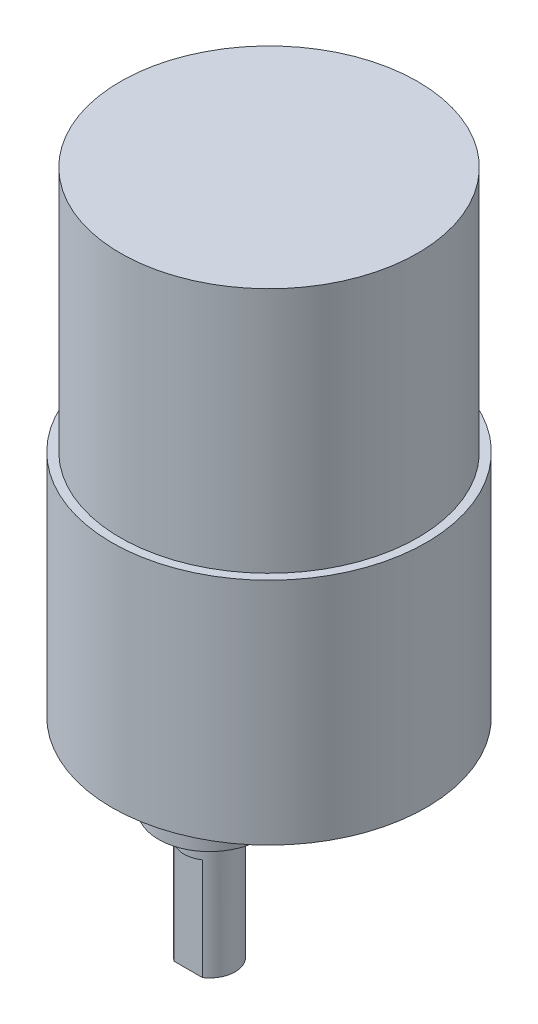
ISO-10303-21;
HEADER;
FILE_DESCRIPTION(('STEP AP214'),'2;1');
FILE_NAME('part.step','',(''),(''),'','','');
FILE_SCHEMA(('AUTOMOTIVE_DESIGN { 1 0 10303 214 1 1 1 1 }'));
ENDSEC;
DATA;
#1=APPLICATION_CONTEXT('core data for automotive mechanical design processes');
#2=APPLICATION_PROTOCOL_DEFINITION('international standard','automotive_design',2000,#1);
#3=PRODUCT_CONTEXT('',#1,'mechanical');
#4=PRODUCT('Part','Part','',(#3));
#5=PRODUCT_RELATED_PRODUCT_CATEGORY('part','',(#4));
#6=PRODUCT_DEFINITION_FORMATION('','',#4);
#7=PRODUCT_DEFINITION_CONTEXT('part definition',#1,'design');
#8=PRODUCT_DEFINITION('design','',#6,#7);
#9=PRODUCT_DEFINITION_SHAPE('','',#8);
#10=(LENGTH_UNIT() NAMED_UNIT(*) SI_UNIT(.MILLI.,.METRE.));
#11=(NAMED_UNIT(*) PLANE_ANGLE_UNIT() SI_UNIT($,.RADIAN.));
#12=(NAMED_UNIT(*) SI_UNIT($,.STERADIAN.) SOLID_ANGLE_UNIT());
#13=UNCERTAINTY_MEASURE_WITH_UNIT(LENGTH_MEASURE(1.E-05),#10,'distance_accuracy_value','');
#14=(GEOMETRIC_REPRESENTATION_CONTEXT(3) GLOBAL_UNCERTAINTY_ASSIGNED_CONTEXT((#13)) GLOBAL_UNIT_ASSIGNED_CONTEXT((#10,
#11,#12)) REPRESENTATION_CONTEXT('',''));
#15=CARTESIAN_POINT('',(0.,0.,0.));
#16=DIRECTION('',(0.,0.,1.));
#17=DIRECTION('',(1.,0.,0.));
#18=AXIS2_PLACEMENT_3D('',#15,#16,#17);
#19=CARTESIAN_POINT('',(0.,27.,0.));
#20=DIRECTION('',(0.,-1.,0.));
#21=DIRECTION('',(0.,0.,-1.));
#22=AXIS2_PLACEMENT_3D('',#19,#20,#21);
#23=CYLINDRICAL_SURFACE('',#22,18.5);
#24=CARTESIAN_POINT('',(0.,27.,0.));
#25=DIRECTION('',(0.,1.,0.));
#26=DIRECTION('',(0.,0.,1.));
#27=AXIS2_PLACEMENT_3D('',#24,#25,#26);
#28=CIRCLE('',#27,18.5);
#29=CARTESIAN_POINT('',(0.,27.,18.5));
#30=VERTEX_POINT('',#29);
#31=EDGE_CURVE('E122',#30,#30,#28,.T.);
#32=ORIENTED_EDGE('',*,*,#31,.F.);
#33=EDGE_LOOP('',(#32));
#34=FACE_BOUND('',#33,.T.);
#35=CARTESIAN_POINT('',(0.,0.,0.));
#36=DIRECTION('',(0.,1.,0.));
#37=DIRECTION('',(0.,0.,1.));
#38=AXIS2_PLACEMENT_3D('',#35,#36,#37);
#39=CIRCLE('',#38,18.5);
#40=CARTESIAN_POINT('',(0.,0.,18.5));
#41=VERTEX_POINT('',#40);
#42=EDGE_CURVE('E119',#41,#41,#39,.T.);
#43=ORIENTED_EDGE('',*,*,#42,.T.);
#44=EDGE_LOOP('',(#43));
#45=FACE_BOUND('',#44,.T.);
#46=ADVANCED_FACE('F33',(#34,#45),#23,.T.);
#47=CARTESIAN_POINT('',(0.,27.,0.));
#48=DIRECTION('',(0.,1.,0.));
#49=DIRECTION('',(0.,0.,1.));
#50=AXIS2_PLACEMENT_3D('',#47,#48,#49);
#51=PLANE('',#50);
#52=CARTESIAN_POINT('',(0.,27.,0.));
#53=DIRECTION('',(0.,1.,0.));
#54=DIRECTION('',(0.,0.,1.));
#55=AXIS2_PLACEMENT_3D('',#52,#53,#54);
#56=CIRCLE('',#55,17.5);
#57=CARTESIAN_POINT('',(0.,27.,-17.5));
#58=VERTEX_POINT('',#57);
#59=EDGE_CURVE('E113',#58,#58,#56,.T.);
#60=ORIENTED_EDGE('',*,*,#59,.F.);
#61=EDGE_LOOP('',(#60));
#62=FACE_BOUND('',#61,.T.);
#63=ORIENTED_EDGE('',*,*,#31,.T.);
#64=EDGE_LOOP('',(#63));
#65=FACE_BOUND('',#64,.T.);
#66=ADVANCED_FACE('F136',(#62,#65),#51,.T.);
#67=CARTESIAN_POINT('',(0.,0.,0.));
#68=DIRECTION('',(0.,1.,0.));
#69=DIRECTION('',(0.,0.,1.));
#70=AXIS2_PLACEMENT_3D('',#67,#68,#69);
#71=PLANE('',#70);
#72=CARTESIAN_POINT('',(0.,0.,7.));
#73=DIRECTION('',(0.,1.,0.));
#74=DIRECTION('',(0.,0.,1.));
#75=AXIS2_PLACEMENT_3D('',#72,#73,#74);
#76=CIRCLE('',#75,6.);
#77=CARTESIAN_POINT('',(0.,0.,13.));
#78=VERTEX_POINT('',#77);
#79=EDGE_CURVE('E61',#78,#78,#76,.F.);
#80=ORIENTED_EDGE('',*,*,#79,.F.);
#81=EDGE_LOOP('',(#80));
#82=FACE_BOUND('',#81,.T.);
#83=CARTESIAN_POINT('',(7.75000000000002,0.,-13.4233937586588));
#84=DIRECTION('',(0.,-1.,0.));
#85=DIRECTION('',(0.,0.,-1.));
#86=AXIS2_PLACEMENT_3D('',#83,#84,#85);
#87=CIRCLE('',#86,1.5);
#88=CARTESIAN_POINT('',(7.75000000000002,0.,-14.9233937586588));
#89=VERTEX_POINT('',#88);
#90=EDGE_CURVE('E74',#89,#89,#87,.T.);
#91=ORIENTED_EDGE('',*,*,#90,.F.);
#92=EDGE_LOOP('',(#91));
#93=FACE_BOUND('',#92,.T.);
#94=CARTESIAN_POINT('',(-7.75000000000003,0.,-13.4233937586588));
#95=DIRECTION('',(0.,-1.,0.));
#96=DIRECTION('',(0.,0.,-1.));
#97=AXIS2_PLACEMENT_3D('',#94,#95,#96);
#98=CIRCLE('',#97,1.5);
#99=CARTESIAN_POINT('',(-7.75000000000003,0.,-14.9233937586588));
#100=VERTEX_POINT('',#99);
#101=EDGE_CURVE('E90',#100,#100,#98,.T.);
#102=ORIENTED_EDGE('',*,*,#101,.F.);
#103=EDGE_LOOP('',(#102));
#104=FACE_BOUND('',#103,.T.);
#105=CARTESIAN_POINT('',(-7.75000000000002,0.,13.4233937586588));
#106=DIRECTION('',(0.,-1.,0.));
#107=DIRECTION('',(0.,0.,-1.));
#108=AXIS2_PLACEMENT_3D('',#105,#106,#107);
#109=CIRCLE('',#108,1.5);
#110=CARTESIAN_POINT('',(-7.75000000000002,0.,11.9233937586588));
#111=VERTEX_POINT('',#110);
#112=EDGE_CURVE('E84',#111,#111,#109,.T.);
#113=ORIENTED_EDGE('',*,*,#112,.F.);
#114=EDGE_LOOP('',(#113));
#115=FACE_BOUND('',#114,.T.);
#116=CARTESIAN_POINT('',(7.75000000000002,0.,13.4233937586588));
#117=DIRECTION('',(0.,-1.,0.));
#118=DIRECTION('',(0.,0.,-1.));
#119=AXIS2_PLACEMENT_3D('',#116,#117,#118);
#120=CIRCLE('',#119,1.5);
#121=CARTESIAN_POINT('',(7.75000000000002,0.,11.9233937586588));
#122=VERTEX_POINT('',#121);
#123=EDGE_CURVE('E83',#122,#122,#120,.T.);
#124=ORIENTED_EDGE('',*,*,#123,.F.);
#125=EDGE_LOOP('',(#124));
#126=FACE_BOUND('',#125,.T.);
#127=CARTESIAN_POINT('',(15.5,0.,0.));
#128=DIRECTION('',(0.,-1.,0.));
#129=DIRECTION('',(0.,0.,-1.));
#130=AXIS2_PLACEMENT_3D('',#127,#128,#129);
#131=CIRCLE('',#130,1.5);
#132=CARTESIAN_POINT('',(15.5,0.,-1.5));
#133=VERTEX_POINT('',#132);
#134=EDGE_CURVE('E102',#133,#133,#131,.T.);
#135=ORIENTED_EDGE('',*,*,#134,.F.);
#136=EDGE_LOOP('',(#135));
#137=FACE_BOUND('',#136,.T.);
#138=CARTESIAN_POINT('',(-15.5,0.,0.));
#139=DIRECTION('',(0.,-1.,0.));
#140=DIRECTION('',(0.,0.,-1.));
#141=AXIS2_PLACEMENT_3D('',#138,#139,#140);
#142=CIRCLE('',#141,1.5);
#143=CARTESIAN_POINT('',(-15.5,0.,-1.5));
#144=VERTEX_POINT('',#143);
#145=EDGE_CURVE('E101',#144,#144,#142,.T.);
#146=ORIENTED_EDGE('',*,*,#145,.F.);
#147=EDGE_LOOP('',(#146));
#148=FACE_BOUND('',#147,.T.);
#149=ORIENTED_EDGE('',*,*,#42,.F.);
#150=EDGE_LOOP('',(#149));
#151=FACE_BOUND('',#150,.T.);
#152=ADVANCED_FACE('F132',(#82,#93,#104,#115,#126,#137,#148,#151),#71,.F.);
#153=CARTESIAN_POINT('',(0.,56.,0.));
#154=DIRECTION('',(0.,-1.,0.));
#155=DIRECTION('',(0.,0.,-1.));
#156=AXIS2_PLACEMENT_3D('',#153,#154,#155);
#157=CYLINDRICAL_SURFACE('',#156,17.5);
#158=CARTESIAN_POINT('',(0.,56.,0.));
#159=DIRECTION('',(0.,1.,0.));
#160=DIRECTION('',(0.,0.,1.));
#161=AXIS2_PLACEMENT_3D('',#158,#159,#160);
#162=CIRCLE('',#161,17.5);
#163=CARTESIAN_POINT('',(0.,56.,-17.5));
#164=VERTEX_POINT('',#163);
#165=EDGE_CURVE('E116',#164,#164,#162,.T.);
#166=CARTESIAN_POINT('',(0.,56.,-17.5));
#167=CARTESIAN_POINT('',(0.,55.6979166666667,-17.5));
#168=CARTESIAN_POINT('',(0.,55.3958333333333,-17.5));
#169=CARTESIAN_POINT('',(0.,54.7916666666667,-17.5));
#170=CARTESIAN_POINT('',(0.,54.4895833333333,-17.5));
#171=CARTESIAN_POINT('',(0.,53.8854166666667,-17.5));
#172=CARTESIAN_POINT('',(0.,53.5833333333333,-17.5));
#173=CARTESIAN_POINT('',(0.,52.9791666666667,-17.5));
#174=CARTESIAN_POINT('',(0.,52.6770833333333,-17.5));
#175=CARTESIAN_POINT('',(0.,52.0729166666667,-17.5));
#176=CARTESIAN_POINT('',(0.,51.7708333333333,-17.5));
#177=CARTESIAN_POINT('',(0.,51.1666666666667,-17.5));
#178=CARTESIAN_POINT('',(0.,50.8645833333333,-17.5));
#179=CARTESIAN_POINT('',(0.,50.2604166666667,-17.5));
#180=CARTESIAN_POINT('',(0.,49.9583333333333,-17.5));
#181=CARTESIAN_POINT('',(0.,49.3541666666667,-17.5));
#182=CARTESIAN_POINT('',(0.,49.0520833333333,-17.5));
#183=CARTESIAN_POINT('',(0.,48.4479166666667,-17.5));
#184=CARTESIAN_POINT('',(0.,48.1458333333333,-17.5));
#185=CARTESIAN_POINT('',(0.,47.5416666666667,-17.5));
#186=CARTESIAN_POINT('',(0.,47.2395833333333,-17.5));
#187=CARTESIAN_POINT('',(0.,46.6354166666667,-17.5));
#188=CARTESIAN_POINT('',(0.,46.3333333333333,-17.5));
#189=CARTESIAN_POINT('',(0.,45.7291666666667,-17.5));
#190=CARTESIAN_POINT('',(0.,45.4270833333333,-17.5));
#191=CARTESIAN_POINT('',(0.,44.8229166666667,-17.5));
#192=CARTESIAN_POINT('',(0.,44.5208333333333,-17.5));
#193=CARTESIAN_POINT('',(0.,43.9166666666667,-17.5));
#194=CARTESIAN_POINT('',(0.,43.6145833333333,-17.5));
#195=CARTESIAN_POINT('',(0.,43.0104166666667,-17.5));
#196=CARTESIAN_POINT('',(0.,42.7083333333333,-17.5));
#197=CARTESIAN_POINT('',(0.,42.1041666666667,-17.5));
#198=CARTESIAN_POINT('',(0.,41.8020833333333,-17.5));
#199=CARTESIAN_POINT('',(0.,41.1979166666667,-17.5));
#200=CARTESIAN_POINT('',(0.,40.8958333333333,-17.5));
#201=CARTESIAN_POINT('',(0.,40.2916666666667,-17.5));
#202=CARTESIAN_POINT('',(0.,39.9895833333333,-17.5));
#203=CARTESIAN_POINT('',(0.,39.3854166666667,-17.5));
#204=CARTESIAN_POINT('',(0.,39.0833333333333,-17.5));
#205=CARTESIAN_POINT('',(0.,38.4791666666667,-17.5));
#206=CARTESIAN_POINT('',(0.,38.1770833333333,-17.5));
#207=CARTESIAN_POINT('',(0.,37.5729166666667,-17.5));
#208=CARTESIAN_POINT('',(0.,37.2708333333333,-17.5));
#209=CARTESIAN_POINT('',(0.,36.6666666666667,-17.5));
#210=CARTESIAN_POINT('',(0.,36.3645833333333,-17.5));
#211=CARTESIAN_POINT('',(0.,35.7604166666667,-17.5));
#212=CARTESIAN_POINT('',(0.,35.4583333333333,-17.5));
#213=CARTESIAN_POINT('',(0.,34.8541666666667,-17.5));
#214=CARTESIAN_POINT('',(0.,34.5520833333333,-17.5));
#215=CARTESIAN_POINT('',(0.,33.9479166666667,-17.5));
#216=CARTESIAN_POINT('',(0.,33.6458333333333,-17.5));
#217=CARTESIAN_POINT('',(0.,33.0416666666667,-17.5));
#218=CARTESIAN_POINT('',(0.,32.7395833333333,-17.5));
#219=CARTESIAN_POINT('',(0.,32.1354166666667,-17.5));
#220=CARTESIAN_POINT('',(0.,31.8333333333333,-17.5));
#221=CARTESIAN_POINT('',(0.,31.2291666666667,-17.5));
#222=CARTESIAN_POINT('',(0.,30.9270833333333,-17.5));
#223=CARTESIAN_POINT('',(0.,30.3229166666667,-17.5));
#224=CARTESIAN_POINT('',(0.,30.0208333333333,-17.5));
#225=CARTESIAN_POINT('',(0.,29.4166666666667,-17.5));
#226=CARTESIAN_POINT('',(0.,29.1145833333333,-17.5));
#227=CARTESIAN_POINT('',(0.,28.5104166666667,-17.5));
#228=CARTESIAN_POINT('',(0.,28.2083333333333,-17.5));
#229=CARTESIAN_POINT('',(0.,27.6041666666667,-17.5));
#230=CARTESIAN_POINT('',(0.,27.3020833333333,-17.5));
#231=CARTESIAN_POINT('',(0.,27.,-17.5));
#232=B_SPLINE_CURVE_WITH_KNOTS('',3,(#166,#167,#168,#169,#170,#171,#172,#173,#174,#175,#176,
#177,#178,#179,#180,#181,#182,#183,#184,#185,#186,#187,#188,#189,#190,#191,#192,#193,#194,#195,
#196,#197,#198,#199,#200,#201,#202,#203,#204,#205,#206,#207,#208,#209,#210,#211,#212,#213,#214,
#215,#216,#217,#218,#219,#220,#221,#222,#223,#224,#225,#226,#227,#228,#229,#230,#231),
.UNSPECIFIED.,.F.,.F.,(4,2,2,2,2,2,2,2,2,2,2,2,2,2,2,2,2,2,2,2,2,2,2,2,2,2,2,2,2,2,2,2,4),(0.,
0.906250000000004,1.8125,2.71875000000001,3.625,4.53125,5.4375,6.34375,7.25,8.15625,9.0625,
9.96875000000001,10.875,11.78125,12.6875,13.59375,14.5,15.40625,16.3125,17.21875,18.125,
19.03125,19.9375,20.84375,21.75,22.65625,23.5625,24.46875,25.375,26.28125,27.1875,28.09375,29.),.UNSPECIFIED.);
#233=EDGE_CURVE('BSEAM135',#164,#58,#232,.T.);
#234=ORIENTED_EDGE('',*,*,#165,.F.);
#235=ORIENTED_EDGE('',*,*,#59,.T.);
#236=ORIENTED_EDGE('',*,*,#233,.T.);
#237=ORIENTED_EDGE('',*,*,#233,.F.);
#238=EDGE_LOOP('',(#234,#236,#235,#237));
#239=FACE_BOUND('',#238,.T.);
#240=ADVANCED_FACE('F135',(#239),#157,.T.);
#241=CARTESIAN_POINT('',(0.,56.,0.));
#242=DIRECTION('',(0.,1.,0.));
#243=DIRECTION('',(0.,0.,1.));
#244=AXIS2_PLACEMENT_3D('',#241,#242,#243);
#245=PLANE('',#244);
#246=ORIENTED_EDGE('',*,*,#165,.T.);
#247=EDGE_LOOP('',(#246));
#248=FACE_BOUND('',#247,.T.);
#249=ADVANCED_FACE('F166',(#248),#245,.T.);
#250=CARTESIAN_POINT('',(-15.5,10.,0.));
#251=DIRECTION('',(0.,-1.,0.));
#252=DIRECTION('',(0.,0.,-1.));
#253=AXIS2_PLACEMENT_3D('',#250,#251,#252);
#254=CYLINDRICAL_SURFACE('',#253,1.5);
#255=CARTESIAN_POINT('',(-15.5,10.,0.));
#256=DIRECTION('',(0.,-1.,0.));
#257=DIRECTION('',(0.,0.,-1.));
#258=AXIS2_PLACEMENT_3D('',#255,#256,#257);
#259=CIRCLE('',#258,1.5);
#260=CARTESIAN_POINT('',(-15.5,10.,-1.5));
#261=VERTEX_POINT('',#260);
#262=EDGE_CURVE('E110',#261,#261,#259,.T.);
#263=ORIENTED_EDGE('',*,*,#262,.F.);
#264=EDGE_LOOP('',(#263));
#265=FACE_BOUND('',#264,.T.);
#266=ORIENTED_EDGE('',*,*,#145,.T.);
#267=EDGE_LOOP('',(#266));
#268=FACE_BOUND('',#267,.T.);
#269=ADVANCED_FACE('F170',(#265,#268),#254,.F.);
#270=CARTESIAN_POINT('',(-15.5,10.,0.));
#271=DIRECTION('',(0.,-1.,0.));
#272=DIRECTION('',(0.,0.,-1.));
#273=AXIS2_PLACEMENT_3D('',#270,#271,#272);
#274=PLANE('',#273);
#275=ORIENTED_EDGE('',*,*,#262,.T.);
#276=EDGE_LOOP('',(#275));
#277=FACE_BOUND('',#276,.T.);
#278=ADVANCED_FACE('F174',(#277),#274,.T.);
#279=CARTESIAN_POINT('',(15.5,10.,0.));
#280=DIRECTION('',(0.,-1.,0.));
#281=DIRECTION('',(0.,0.,-1.));
#282=AXIS2_PLACEMENT_3D('',#279,#280,#281);
#283=CYLINDRICAL_SURFACE('',#282,1.5);
#284=CARTESIAN_POINT('',(15.5,10.,0.));
#285=DIRECTION('',(0.,-1.,0.));
#286=DIRECTION('',(0.,0.,-1.));
#287=AXIS2_PLACEMENT_3D('',#284,#285,#286);
#288=CIRCLE('',#287,1.5);
#289=CARTESIAN_POINT('',(15.5,10.,-1.5));
#290=VERTEX_POINT('',#289);
#291=EDGE_CURVE('E98',#290,#290,#288,.T.);
#292=ORIENTED_EDGE('',*,*,#291,.F.);
#293=EDGE_LOOP('',(#292));
#294=FACE_BOUND('',#293,.T.);
#295=ORIENTED_EDGE('',*,*,#134,.T.);
#296=EDGE_LOOP('',(#295));
#297=FACE_BOUND('',#296,.T.);
#298=ADVANCED_FACE('F178',(#294,#297),#283,.F.);
#299=CARTESIAN_POINT('',(15.5,10.,0.));
#300=DIRECTION('',(0.,-1.,0.));
#301=DIRECTION('',(0.,0.,-1.));
#302=AXIS2_PLACEMENT_3D('',#299,#300,#301);
#303=PLANE('',#302);
#304=ORIENTED_EDGE('',*,*,#291,.T.);
#305=EDGE_LOOP('',(#304));
#306=FACE_BOUND('',#305,.T.);
#307=ADVANCED_FACE('F184',(#306),#303,.T.);
#308=CARTESIAN_POINT('',(7.75000000000002,10.,13.4233937586588));
#309=DIRECTION('',(0.,-1.,0.));
#310=DIRECTION('',(0.,0.,-1.));
#311=AXIS2_PLACEMENT_3D('',#308,#309,#310);
#312=CYLINDRICAL_SURFACE('',#311,1.5);
#313=CARTESIAN_POINT('',(7.75000000000002,10.,13.4233937586588));
#314=DIRECTION('',(0.,-1.,0.));
#315=DIRECTION('',(0.,0.,-1.));
#316=AXIS2_PLACEMENT_3D('',#313,#314,#315);
#317=CIRCLE('',#316,1.5);
#318=CARTESIAN_POINT('',(7.75000000000002,10.,11.9233937586588));
#319=VERTEX_POINT('',#318);
#320=EDGE_CURVE('E105',#319,#319,#317,.T.);
#321=ORIENTED_EDGE('',*,*,#320,.F.);
#322=EDGE_LOOP('',(#321));
#323=FACE_BOUND('',#322,.T.);
#324=ORIENTED_EDGE('',*,*,#123,.T.);
#325=EDGE_LOOP('',(#324));
#326=FACE_BOUND('',#325,.T.);
#327=ADVANCED_FACE('F180',(#323,#326),#312,.F.);
#328=CARTESIAN_POINT('',(7.75000000000002,10.,13.4233937586588));
#329=DIRECTION('',(0.,-1.,0.));
#330=DIRECTION('',(0.,0.,-1.));
#331=AXIS2_PLACEMENT_3D('',#328,#329,#330);
#332=PLANE('',#331);
#333=ORIENTED_EDGE('',*,*,#320,.T.);
#334=EDGE_LOOP('',(#333));
#335=FACE_BOUND('',#334,.T.);
#336=ADVANCED_FACE('F183',(#335),#332,.T.);
#337=CARTESIAN_POINT('',(-7.75000000000002,10.,13.4233937586588));
#338=DIRECTION('',(0.,-1.,0.));
#339=DIRECTION('',(0.,0.,-1.));
#340=AXIS2_PLACEMENT_3D('',#337,#338,#339);
#341=CYLINDRICAL_SURFACE('',#340,1.5);
#342=CARTESIAN_POINT('',(-7.75000000000002,10.,13.4233937586588));
#343=DIRECTION('',(0.,-1.,0.));
#344=DIRECTION('',(0.,0.,-1.));
#345=AXIS2_PLACEMENT_3D('',#342,#343,#344);
#346=CIRCLE('',#345,1.5);
#347=CARTESIAN_POINT('',(-7.75000000000002,10.,11.9233937586588));
#348=VERTEX_POINT('',#347);
#349=EDGE_CURVE('E80',#348,#348,#346,.T.);
#350=ORIENTED_EDGE('',*,*,#349,.F.);
#351=EDGE_LOOP('',(#350));
#352=FACE_BOUND('',#351,.T.);
#353=ORIENTED_EDGE('',*,*,#112,.T.);
#354=EDGE_LOOP('',(#353));
#355=FACE_BOUND('',#354,.T.);
#356=ADVANCED_FACE('F188',(#352,#355),#341,.F.);
#357=CARTESIAN_POINT('',(-7.75000000000002,10.,13.4233937586588));
#358=DIRECTION('',(0.,-1.,0.));
#359=DIRECTION('',(0.,0.,-1.));
#360=AXIS2_PLACEMENT_3D('',#357,#358,#359);
#361=PLANE('',#360);
#362=ORIENTED_EDGE('',*,*,#349,.T.);
#363=EDGE_LOOP('',(#362));
#364=FACE_BOUND('',#363,.T.);
#365=ADVANCED_FACE('F208',(#364),#361,.T.);
#366=CARTESIAN_POINT('',(-7.75000000000003,10.,-13.4233937586588));
#367=DIRECTION('',(0.,-1.,0.));
#368=DIRECTION('',(0.,0.,-1.));
#369=AXIS2_PLACEMENT_3D('',#366,#367,#368);
#370=CYLINDRICAL_SURFACE('',#369,1.5);
#371=CARTESIAN_POINT('',(-7.75000000000003,10.,-13.4233937586588));
#372=DIRECTION('',(0.,-1.,0.));
#373=DIRECTION('',(0.,0.,-1.));
#374=AXIS2_PLACEMENT_3D('',#371,#372,#373);
#375=CIRCLE('',#374,1.5);
#376=CARTESIAN_POINT('',(-7.75000000000003,10.,-14.9233937586588));
#377=VERTEX_POINT('',#376);
#378=EDGE_CURVE('E87',#377,#377,#375,.T.);
#379=ORIENTED_EDGE('',*,*,#378,.F.);
#380=EDGE_LOOP('',(#379));
#381=FACE_BOUND('',#380,.T.);
#382=ORIENTED_EDGE('',*,*,#101,.T.);
#383=EDGE_LOOP('',(#382));
#384=FACE_BOUND('',#383,.T.);
#385=ADVANCED_FACE('F205',(#381,#384),#370,.F.);
#386=CARTESIAN_POINT('',(-7.75000000000003,10.,-13.4233937586588));
#387=DIRECTION('',(0.,-1.,0.));
#388=DIRECTION('',(0.,0.,-1.));
#389=AXIS2_PLACEMENT_3D('',#386,#387,#388);
#390=PLANE('',#389);
#391=ORIENTED_EDGE('',*,*,#378,.T.);
#392=EDGE_LOOP('',(#391));
#393=FACE_BOUND('',#392,.T.);
#394=ADVANCED_FACE('F200',(#393),#390,.T.);
#395=CARTESIAN_POINT('',(7.75000000000002,10.,-13.4233937586588));
#396=DIRECTION('',(0.,-1.,0.));
#397=DIRECTION('',(0.,0.,-1.));
#398=AXIS2_PLACEMENT_3D('',#395,#396,#397);
#399=CYLINDRICAL_SURFACE('',#398,1.5);
#400=CARTESIAN_POINT('',(7.75000000000002,10.,-13.4233937586588));
#401=DIRECTION('',(0.,-1.,0.));
#402=DIRECTION('',(0.,0.,-1.));
#403=AXIS2_PLACEMENT_3D('',#400,#401,#402);
#404=CIRCLE('',#403,1.5);
#405=CARTESIAN_POINT('',(7.75000000000002,10.,-14.9233937586588));
#406=VERTEX_POINT('',#405);
#407=EDGE_CURVE('E93',#406,#406,#404,.T.);
#408=ORIENTED_EDGE('',*,*,#407,.F.);
#409=EDGE_LOOP('',(#408));
#410=FACE_BOUND('',#409,.T.);
#411=ORIENTED_EDGE('',*,*,#90,.T.);
#412=EDGE_LOOP('',(#411));
#413=FACE_BOUND('',#412,.T.);
#414=ADVANCED_FACE('F196',(#410,#413),#399,.F.);
#415=CARTESIAN_POINT('',(7.75000000000002,10.,-13.4233937586588));
#416=DIRECTION('',(0.,-1.,0.));
#417=DIRECTION('',(0.,0.,-1.));
#418=AXIS2_PLACEMENT_3D('',#415,#416,#417);
#419=PLANE('',#418);
#420=ORIENTED_EDGE('',*,*,#407,.T.);
#421=EDGE_LOOP('',(#420));
#422=FACE_BOUND('',#421,.T.);
#423=ADVANCED_FACE('F199',(#422),#419,.T.);
#424=CARTESIAN_POINT('',(0.,-6.,7.));
#425=DIRECTION('',(0.,1.,0.));
#426=DIRECTION('',(0.,0.,1.));
#427=AXIS2_PLACEMENT_3D('',#424,#425,#426);
#428=CYLINDRICAL_SURFACE('',#427,6.);
#429=CARTESIAN_POINT('',(0.,-6.,7.));
#430=DIRECTION('',(0.,-1.,0.));
#431=DIRECTION('',(0.,0.,-1.));
#432=AXIS2_PLACEMENT_3D('',#429,#430,#431);
#433=CIRCLE('',#432,6.);
#434=CARTESIAN_POINT('',(0.,-6.,0.999999999999999));
#435=VERTEX_POINT('',#434);
#436=EDGE_CURVE('E70',#435,#435,#433,.T.);
#437=ORIENTED_EDGE('',*,*,#436,.F.);
#438=EDGE_LOOP('',(#437));
#439=FACE_BOUND('',#438,.T.);
#440=ORIENTED_EDGE('',*,*,#79,.T.);
#441=EDGE_LOOP('',(#440));
#442=FACE_BOUND('',#441,.T.);
#443=ADVANCED_FACE('F130',(#439,#442),#428,.T.);
#444=CARTESIAN_POINT('',(0.,-6.,7.));
#445=DIRECTION('',(0.,-1.,0.));
#446=DIRECTION('',(0.,0.,-1.));
#447=AXIS2_PLACEMENT_3D('',#444,#445,#446);
#448=PLANE('',#447);
#449=CARTESIAN_POINT('',(0.,-6.,7.));
#450=DIRECTION('',(0.,-1.,0.));
#451=DIRECTION('',(0.,0.,-1.));
#452=AXIS2_PLACEMENT_3D('',#449,#450,#451);
#453=CIRCLE('',#452,3.);
#454=CARTESIAN_POINT('',(0.,-6.,4.));
#455=VERTEX_POINT('',#454);
#456=EDGE_CURVE('E71',#455,#455,#453,.T.);
#457=ORIENTED_EDGE('',*,*,#456,.F.);
#458=EDGE_LOOP('',(#457));
#459=FACE_BOUND('',#458,.T.);
#460=ORIENTED_EDGE('',*,*,#436,.T.);
#461=EDGE_LOOP('',(#460));
#462=FACE_BOUND('',#461,.T.);
#463=ADVANCED_FACE('F221',(#459,#462),#448,.T.);
#464=CARTESIAN_POINT('',(0.,-21.,7.));
#465=DIRECTION('',(0.,1.,0.));
#466=DIRECTION('',(0.,0.,1.));
#467=AXIS2_PLACEMENT_3D('',#464,#465,#466);
#468=CYLINDRICAL_SURFACE('',#467,3.);
#469=CARTESIAN_POINT('',(0.,-21.,7.));
#470=DIRECTION('',(0.,-1.,0.));
#471=DIRECTION('',(0.,0.,-1.));
#472=AXIS2_PLACEMENT_3D('',#469,#470,#471);
#473=CIRCLE('',#472,3.);
#474=CARTESIAN_POINT('',(-1.6583123951777,-21.,9.5));
#475=VERTEX_POINT('',#474);
#476=CARTESIAN_POINT('',(1.6583123951777,-21.,9.5));
#477=VERTEX_POINT('',#476);
#478=EDGE_CURVE('E66',#475,#477,#473,.T.);
#479=ORIENTED_EDGE('',*,*,#478,.F.);
#480=DIRECTION('',(0.,1.,0.));
#481=VECTOR('',#480,1.);
#482=CARTESIAN_POINT('',(-1.6583123951777,-21.,9.5));
#483=LINE('',#482,#481);
#484=CARTESIAN_POINT('',(-1.6583123951777,-9.,9.5));
#485=VERTEX_POINT('',#484);
#486=EDGE_CURVE('E47',#475,#485,#483,.T.);
#487=ORIENTED_EDGE('',*,*,#486,.T.);
#488=CARTESIAN_POINT('',(0.,-9.,7.));
#489=DIRECTION('',(0.,-1.,0.));
#490=DIRECTION('',(0.,0.,-1.));
#491=AXIS2_PLACEMENT_3D('',#488,#489,#490);
#492=CIRCLE('',#491,3.);
#493=CARTESIAN_POINT('',(1.6583123951777,-9.,9.5));
#494=VERTEX_POINT('',#493);
#495=EDGE_CURVE('E11',#494,#485,#492,.T.);
#496=ORIENTED_EDGE('',*,*,#495,.F.);
#497=DIRECTION('',(0.,1.,0.));
#498=VECTOR('',#497,1.);
#499=CARTESIAN_POINT('',(1.6583123951777,-21.,9.5));
#500=LINE('',#499,#498);
#501=EDGE_CURVE('E52',#494,#477,#500,.F.);
#502=ORIENTED_EDGE('',*,*,#501,.T.);
#503=EDGE_LOOP('',(#479,#487,#496,#502));
#504=FACE_BOUND('',#503,.T.);
#505=ORIENTED_EDGE('',*,*,#456,.T.);
#506=EDGE_LOOP('',(#505));
#507=FACE_BOUND('',#506,.T.);
#508=ADVANCED_FACE('F64',(#504,#507),#468,.T.);
#509=CARTESIAN_POINT('',(0.,-21.,7.));
#510=DIRECTION('',(0.,-1.,0.));
#511=DIRECTION('',(0.,0.,-1.));
#512=AXIS2_PLACEMENT_3D('',#509,#510,#511);
#513=PLANE('',#512);
#514=DIRECTION('',(1.,0.,0.));
#515=VECTOR('',#514,1.);
#516=CARTESIAN_POINT('',(0.,-21.,9.5));
#517=LINE('',#516,#515);
#518=EDGE_CURVE('E40',#475,#477,#517,.T.);
#519=ORIENTED_EDGE('',*,*,#518,.F.);
#520=ORIENTED_EDGE('',*,*,#478,.T.);
#521=EDGE_LOOP('',(#519,#520));
#522=FACE_BOUND('',#521,.T.);
#523=ADVANCED_FACE('F69',(#522),#513,.T.);
#524=CARTESIAN_POINT('',(0.,-9.,0.));
#525=DIRECTION('',(0.,-1.,0.));
#526=DIRECTION('',(0.,0.,-1.));
#527=AXIS2_PLACEMENT_3D('',#524,#525,#526);
#528=PLANE('',#527);
#529=ORIENTED_EDGE('',*,*,#495,.T.);
#530=DIRECTION('',(1.,0.,0.));
#531=VECTOR('',#530,1.);
#532=CARTESIAN_POINT('',(-3.,-9.,9.5));
#533=LINE('',#532,#531);
#534=EDGE_CURVE('E67',#485,#494,#533,.T.);
#535=ORIENTED_EDGE('',*,*,#534,.T.);
#536=EDGE_LOOP('',(#529,#535));
#537=FACE_BOUND('',#536,.T.);
#538=ADVANCED_FACE('F230',(#537),#528,.T.);
#539=CARTESIAN_POINT('',(-3.,-9.,9.5));
#540=DIRECTION('',(0.,0.,-1.));
#541=DIRECTION('',(-1.,0.,0.));
#542=AXIS2_PLACEMENT_3D('',#539,#540,#541);
#543=PLANE('',#542);
#544=ORIENTED_EDGE('',*,*,#518,.T.);
#545=ORIENTED_EDGE('',*,*,#501,.F.);
#546=ORIENTED_EDGE('',*,*,#534,.F.);
#547=ORIENTED_EDGE('',*,*,#486,.F.);
#548=EDGE_LOOP('',(#544,#545,#546,#547));
#549=FACE_BOUND('',#548,.T.);
#550=ADVANCED_FACE('F57',(#549),#543,.F.);
#551=CLOSED_SHELL('',(#46,#66,#152,#240,#249,#269,#278,#298,#307,#327,#336,#356,#365,#385,#394,
#414,#423,#443,#463,#508,#523,#538,#550));
#552=MANIFOLD_SOLID_BREP('B2',#551);
#553=ADVANCED_BREP_SHAPE_REPRESENTATION('',(#18,#552),#14);
#554=SHAPE_DEFINITION_REPRESENTATION(#9,#553);
ENDSEC;
END-ISO-10303-21;
